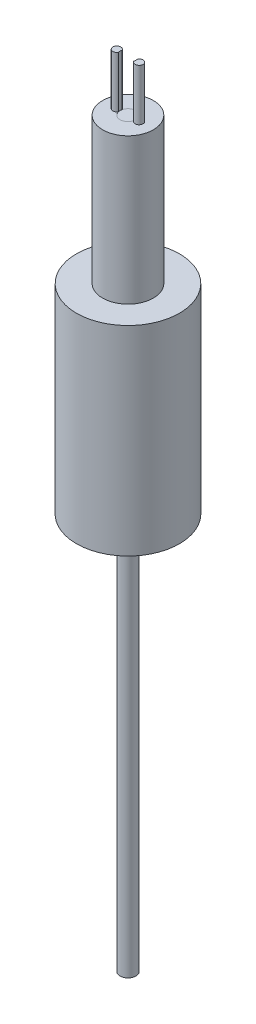
ISO-10303-21;
HEADER;
FILE_DESCRIPTION(('STEP AP214'),'2;1');
FILE_NAME('part.step','',(''),(''),'','','');
FILE_SCHEMA(('AUTOMOTIVE_DESIGN { 1 0 10303 214 1 1 1 1 }'));
ENDSEC;
DATA;
#1=APPLICATION_CONTEXT('core data for automotive mechanical design processes');
#2=APPLICATION_PROTOCOL_DEFINITION('international standard','automotive_design',2000,#1);
#3=PRODUCT_CONTEXT('',#1,'mechanical');
#4=PRODUCT('Part','Part','',(#3));
#5=PRODUCT_RELATED_PRODUCT_CATEGORY('part','',(#4));
#6=PRODUCT_DEFINITION_FORMATION('','',#4);
#7=PRODUCT_DEFINITION_CONTEXT('part definition',#1,'design');
#8=PRODUCT_DEFINITION('design','',#6,#7);
#9=PRODUCT_DEFINITION_SHAPE('','',#8);
#10=(LENGTH_UNIT() NAMED_UNIT(*) SI_UNIT(.MILLI.,.METRE.));
#11=(NAMED_UNIT(*) PLANE_ANGLE_UNIT() SI_UNIT($,.RADIAN.));
#12=(NAMED_UNIT(*) SI_UNIT($,.STERADIAN.) SOLID_ANGLE_UNIT());
#13=UNCERTAINTY_MEASURE_WITH_UNIT(LENGTH_MEASURE(1.E-05),#10,'distance_accuracy_value','');
#14=(GEOMETRIC_REPRESENTATION_CONTEXT(3) GLOBAL_UNCERTAINTY_ASSIGNED_CONTEXT((#13)) GLOBAL_UNIT_ASSIGNED_CONTEXT((#10,
#11,#12)) REPRESENTATION_CONTEXT('',''));
#15=CARTESIAN_POINT('',(0.,0.,0.));
#16=DIRECTION('',(0.,0.,1.));
#17=DIRECTION('',(1.,0.,0.));
#18=AXIS2_PLACEMENT_3D('',#15,#16,#17);
#19=CARTESIAN_POINT('',(0.,43.6,0.));
#20=DIRECTION('',(0.,-1.,0.));
#21=DIRECTION('',(0.,0.,-1.));
#22=AXIS2_PLACEMENT_3D('',#19,#20,#21);
#23=CYLINDRICAL_SURFACE('',#22,1.);
#24=CARTESIAN_POINT('',(0.,43.6,0.));
#25=DIRECTION('',(0.,1.,0.));
#26=DIRECTION('',(0.,0.,1.));
#27=AXIS2_PLACEMENT_3D('',#24,#25,#26);
#28=CIRCLE('',#27,1.);
#29=CARTESIAN_POINT('',(0.,43.6,1.));
#30=VERTEX_POINT('',#29);
#31=EDGE_CURVE('E11',#30,#30,#28,.T.);
#32=ORIENTED_EDGE('',*,*,#31,.F.);
#33=EDGE_LOOP('',(#32));
#34=FACE_BOUND('',#33,.T.);
#35=CARTESIAN_POINT('',(0.,-50.,0.));
#36=DIRECTION('',(0.,1.,0.));
#37=DIRECTION('',(0.,0.,1.));
#38=AXIS2_PLACEMENT_3D('',#35,#36,#37);
#39=CIRCLE('',#38,1.);
#40=CARTESIAN_POINT('',(0.,-50.,1.));
#41=VERTEX_POINT('',#40);
#42=EDGE_CURVE('E59',#41,#41,#39,.T.);
#43=ORIENTED_EDGE('',*,*,#42,.T.);
#44=EDGE_LOOP('',(#43));
#45=FACE_BOUND('',#44,.T.);
#46=ADVANCED_FACE('F53',(#34,#45),#23,.T.);
#47=CARTESIAN_POINT('',(0.,43.6,0.));
#48=DIRECTION('',(0.,1.,0.));
#49=DIRECTION('',(0.,0.,1.));
#50=AXIS2_PLACEMENT_3D('',#47,#48,#49);
#51=PLANE('',#50);
#52=ORIENTED_EDGE('',*,*,#31,.T.);
#53=EDGE_LOOP('',(#52));
#54=FACE_BOUND('',#53,.T.);
#55=ADVANCED_FACE('F68',(#54),#51,.T.);
#56=CARTESIAN_POINT('',(0.,-50.,0.));
#57=DIRECTION('',(0.,1.,0.));
#58=DIRECTION('',(0.,0.,1.));
#59=AXIS2_PLACEMENT_3D('',#56,#57,#58);
#60=PLANE('',#59);
#61=ORIENTED_EDGE('',*,*,#42,.F.);
#62=EDGE_LOOP('',(#61));
#63=FACE_BOUND('',#62,.T.);
#64=ADVANCED_FACE('F66',(#63),#60,.F.);
#65=CLOSED_SHELL('',(#46,#55,#64));
#66=MANIFOLD_SOLID_BREP('B2',#65);
#67=CARTESIAN_POINT('',(0.,50.1,0.));
#68=DIRECTION('',(0.,-1.,0.));
#69=DIRECTION('',(0.,0.,-1.));
#70=AXIS2_PLACEMENT_3D('',#67,#68,#69);
#71=CYLINDRICAL_SURFACE('',#70,1.);
#72=CARTESIAN_POINT('',(0.,0.,0.));
#73=DIRECTION('',(0.,1.,0.));
#74=DIRECTION('',(0.,0.,1.));
#75=AXIS2_PLACEMENT_3D('',#72,#73,#74);
#76=CIRCLE('',#75,1.);
#77=CARTESIAN_POINT('',(0.,0.,1.));
#78=VERTEX_POINT('',#77);
#79=EDGE_CURVE('E185',#78,#78,#76,.T.);
#80=ORIENTED_EDGE('',*,*,#79,.F.);
#81=EDGE_LOOP('',(#80));
#82=FACE_BOUND('',#81,.T.);
#83=DIRECTION('',(0.,-1.,0.));
#84=VECTOR('',#83,1.);
#85=CARTESIAN_POINT('',(-0.969692309701334,50.1,0.244329336155307));
#86=LINE('',#85,#84);
#87=CARTESIAN_POINT('',(-0.969692309701334,50.1,0.244329336155307));
#88=VERTEX_POINT('',#87);
#89=CARTESIAN_POINT('',(-0.969692309701334,43.6,0.244329336155307));
#90=VERTEX_POINT('',#89);
#91=EDGE_CURVE('E160',#88,#90,#86,.T.);
#92=ORIENTED_EDGE('',*,*,#91,.T.);
#93=CARTESIAN_POINT('',(0.,43.6,0.));
#94=DIRECTION('',(0.,1.,0.));
#95=DIRECTION('',(0.,0.,1.));
#96=AXIS2_PLACEMENT_3D('',#93,#94,#95);
#97=CIRCLE('',#96,1.);
#98=CARTESIAN_POINT('',(0.969692309701334,43.6,0.244329336155307));
#99=VERTEX_POINT('',#98);
#100=EDGE_CURVE('E178',#90,#99,#97,.T.);
#101=ORIENTED_EDGE('',*,*,#100,.T.);
#102=DIRECTION('',(0.,-1.,0.));
#103=VECTOR('',#102,1.);
#104=CARTESIAN_POINT('',(0.969692309701334,50.1,0.244329336155307));
#105=LINE('',#104,#103);
#106=CARTESIAN_POINT('',(0.969692309701334,50.1,0.244329336155307));
#107=VERTEX_POINT('',#106);
#108=EDGE_CURVE('E51',#107,#99,#105,.T.);
#109=ORIENTED_EDGE('',*,*,#108,.F.);
#110=CARTESIAN_POINT('',(0.,50.1,0.));
#111=DIRECTION('',(0.,1.,0.));
#112=DIRECTION('',(0.,0.,1.));
#113=AXIS2_PLACEMENT_3D('',#110,#111,#112);
#114=CIRCLE('',#113,1.);
#115=CARTESIAN_POINT('',(0.969692309701334,50.1,-0.244329336155307));
#116=VERTEX_POINT('',#115);
#117=EDGE_CURVE('E186',#107,#116,#114,.T.);
#118=ORIENTED_EDGE('',*,*,#117,.T.);
#119=DIRECTION('',(0.,-1.,0.));
#120=VECTOR('',#119,1.);
#121=CARTESIAN_POINT('',(0.969692309701334,50.1,-0.244329336155307));
#122=LINE('',#121,#120);
#123=CARTESIAN_POINT('',(0.969692309701334,43.6,-0.244329336155307));
#124=VERTEX_POINT('',#123);
#125=EDGE_CURVE('E120',#116,#124,#122,.T.);
#126=ORIENTED_EDGE('',*,*,#125,.T.);
#127=CARTESIAN_POINT('',(-0.969692309701334,43.6,-0.244329336155307));
#128=VERTEX_POINT('',#127);
#129=EDGE_CURVE('E156',#124,#128,#97,.T.);
#130=ORIENTED_EDGE('',*,*,#129,.T.);
#131=DIRECTION('',(0.,-1.,0.));
#132=VECTOR('',#131,1.);
#133=CARTESIAN_POINT('',(-0.969692309701334,50.1,-0.244329336155307));
#134=LINE('',#133,#132);
#135=CARTESIAN_POINT('',(-0.969692309701334,50.1,-0.244329336155307));
#136=VERTEX_POINT('',#135);
#137=EDGE_CURVE('E150',#136,#128,#134,.T.);
#138=ORIENTED_EDGE('',*,*,#137,.F.);
#139=CARTESIAN_POINT('',(0.,50.1,0.));
#140=DIRECTION('',(0.,1.,0.));
#141=DIRECTION('',(0.,0.,1.));
#142=AXIS2_PLACEMENT_3D('',#139,#140,#141);
#143=CIRCLE('',#142,1.);
#144=EDGE_CURVE('E154',#136,#88,#143,.T.);
#145=ORIENTED_EDGE('',*,*,#144,.T.);
#146=EDGE_LOOP('',(#92,#101,#109,#118,#126,#130,#138,#145));
#147=FACE_BOUND('',#146,.T.);
#148=ADVANCED_FACE('F113',(#82,#147),#71,.F.);
#149=CARTESIAN_POINT('',(1.40592983157893,50.1,0.));
#150=DIRECTION('',(0.,-1.,0.));
#151=DIRECTION('',(0.,0.,-1.));
#152=AXIS2_PLACEMENT_3D('',#149,#150,#151);
#153=CYLINDRICAL_SURFACE('',#152,0.5);
#154=ORIENTED_EDGE('',*,*,#108,.T.);
#155=CARTESIAN_POINT('',(1.40592983157893,43.6,0.));
#156=DIRECTION('',(0.,1.,0.));
#157=DIRECTION('',(0.,0.,1.));
#158=AXIS2_PLACEMENT_3D('',#155,#156,#157);
#159=CIRCLE('',#158,0.5);
#160=EDGE_CURVE('E129',#99,#124,#159,.T.);
#161=ORIENTED_EDGE('',*,*,#160,.T.);
#162=ORIENTED_EDGE('',*,*,#125,.F.);
#163=CARTESIAN_POINT('',(1.40592983157893,50.1,0.));
#164=DIRECTION('',(0.,1.,0.));
#165=DIRECTION('',(0.,0.,1.));
#166=AXIS2_PLACEMENT_3D('',#163,#164,#165);
#167=CIRCLE('',#166,0.5);
#168=EDGE_CURVE('E189',#107,#116,#167,.T.);
#169=ORIENTED_EDGE('',*,*,#168,.F.);
#170=EDGE_LOOP('',(#154,#161,#162,#169));
#171=FACE_BOUND('',#170,.T.);
#172=ADVANCED_FACE('F197',(#171),#153,.T.);
#173=CARTESIAN_POINT('',(0.,50.1,0.));
#174=DIRECTION('',(0.,1.,0.));
#175=DIRECTION('',(0.,0.,1.));
#176=AXIS2_PLACEMENT_3D('',#173,#174,#175);
#177=PLANE('',#176);
#178=ORIENTED_EDGE('',*,*,#117,.F.);
#179=ORIENTED_EDGE('',*,*,#168,.T.);
#180=EDGE_LOOP('',(#178,#179));
#181=FACE_BOUND('',#180,.T.);
#182=ADVANCED_FACE('F199',(#181),#177,.T.);
#183=CARTESIAN_POINT('',(0.,0.,0.));
#184=DIRECTION('',(0.,1.,0.));
#185=DIRECTION('',(0.,0.,1.));
#186=AXIS2_PLACEMENT_3D('',#183,#184,#185);
#187=PLANE('',#186);
#188=ORIENTED_EDGE('',*,*,#79,.T.);
#189=EDGE_LOOP('',(#188));
#190=FACE_BOUND('',#189,.T.);
#191=CARTESIAN_POINT('',(0.,0.,0.));
#192=DIRECTION('',(0.,1.,0.));
#193=DIRECTION('',(0.,0.,1.));
#194=AXIS2_PLACEMENT_3D('',#191,#192,#193);
#195=CIRCLE('',#194,6.5);
#196=CARTESIAN_POINT('',(0.,0.,6.5));
#197=VERTEX_POINT('',#196);
#198=EDGE_CURVE('E174',#197,#197,#195,.T.);
#199=ORIENTED_EDGE('',*,*,#198,.F.);
#200=EDGE_LOOP('',(#199));
#201=FACE_BOUND('',#200,.T.);
#202=ADVANCED_FACE('F201',(#190,#201),#187,.F.);
#203=CARTESIAN_POINT('',(0.,43.6,0.));
#204=DIRECTION('',(0.,-1.,0.));
#205=DIRECTION('',(0.,0.,-1.));
#206=AXIS2_PLACEMENT_3D('',#203,#204,#205);
#207=CYLINDRICAL_SURFACE('',#206,3.2);
#208=CARTESIAN_POINT('',(0.,25.2,0.));
#209=DIRECTION('',(0.,1.,0.));
#210=DIRECTION('',(0.,0.,1.));
#211=AXIS2_PLACEMENT_3D('',#208,#209,#210);
#212=CIRCLE('',#211,3.2);
#213=CARTESIAN_POINT('',(0.,25.2,3.2));
#214=VERTEX_POINT('',#213);
#215=EDGE_CURVE('E171',#214,#214,#212,.T.);
#216=ORIENTED_EDGE('',*,*,#215,.T.);
#217=EDGE_LOOP('',(#216));
#218=FACE_BOUND('',#217,.T.);
#219=CARTESIAN_POINT('',(0.,43.6,0.));
#220=DIRECTION('',(0.,1.,0.));
#221=DIRECTION('',(0.,0.,1.));
#222=AXIS2_PLACEMENT_3D('',#219,#220,#221);
#223=CIRCLE('',#222,3.2);
#224=CARTESIAN_POINT('',(0.,43.6,3.2));
#225=VERTEX_POINT('',#224);
#226=EDGE_CURVE('E182',#225,#225,#223,.T.);
#227=ORIENTED_EDGE('',*,*,#226,.F.);
#228=EDGE_LOOP('',(#227));
#229=FACE_BOUND('',#228,.T.);
#230=ADVANCED_FACE('F207',(#218,#229),#207,.T.);
#231=CARTESIAN_POINT('',(0.,43.6,0.));
#232=DIRECTION('',(0.,1.,0.));
#233=DIRECTION('',(0.,0.,1.));
#234=AXIS2_PLACEMENT_3D('',#231,#232,#233);
#235=PLANE('',#234);
#236=ORIENTED_EDGE('',*,*,#129,.F.);
#237=ORIENTED_EDGE('',*,*,#160,.F.);
#238=ORIENTED_EDGE('',*,*,#100,.F.);
#239=CARTESIAN_POINT('',(-1.40592983157893,43.6,0.));
#240=DIRECTION('',(0.,1.,0.));
#241=DIRECTION('',(0.,0.,1.));
#242=AXIS2_PLACEMENT_3D('',#239,#240,#241);
#243=CIRCLE('',#242,0.5);
#244=EDGE_CURVE('E180',#128,#90,#243,.T.);
#245=ORIENTED_EDGE('',*,*,#244,.F.);
#246=EDGE_LOOP('',(#236,#237,#238,#245));
#247=FACE_BOUND('',#246,.T.);
#248=ORIENTED_EDGE('',*,*,#226,.T.);
#249=EDGE_LOOP('',(#248));
#250=FACE_BOUND('',#249,.T.);
#251=ADVANCED_FACE('F194',(#247,#250),#235,.T.);
#252=CARTESIAN_POINT('',(-1.40592983157893,50.1,0.));
#253=DIRECTION('',(0.,-1.,0.));
#254=DIRECTION('',(0.,0.,-1.));
#255=AXIS2_PLACEMENT_3D('',#252,#253,#254);
#256=CYLINDRICAL_SURFACE('',#255,0.5);
#257=ORIENTED_EDGE('',*,*,#244,.T.);
#258=ORIENTED_EDGE('',*,*,#91,.F.);
#259=CARTESIAN_POINT('',(-1.40592983157893,50.1,0.));
#260=DIRECTION('',(0.,1.,0.));
#261=DIRECTION('',(0.,0.,1.));
#262=AXIS2_PLACEMENT_3D('',#259,#260,#261);
#263=CIRCLE('',#262,0.5);
#264=EDGE_CURVE('E163',#136,#88,#263,.T.);
#265=ORIENTED_EDGE('',*,*,#264,.F.);
#266=ORIENTED_EDGE('',*,*,#137,.T.);
#267=EDGE_LOOP('',(#257,#258,#265,#266));
#268=FACE_BOUND('',#267,.T.);
#269=ADVANCED_FACE('F164',(#268),#256,.T.);
#270=CARTESIAN_POINT('',(0.,50.1,0.));
#271=DIRECTION('',(0.,1.,0.));
#272=DIRECTION('',(0.,0.,1.));
#273=AXIS2_PLACEMENT_3D('',#270,#271,#272);
#274=PLANE('',#273);
#275=ORIENTED_EDGE('',*,*,#144,.F.);
#276=ORIENTED_EDGE('',*,*,#264,.T.);
#277=EDGE_LOOP('',(#275,#276));
#278=FACE_BOUND('',#277,.T.);
#279=ADVANCED_FACE('F167',(#278),#274,.T.);
#280=CARTESIAN_POINT('',(0.,25.2,0.));
#281=DIRECTION('',(0.,-1.,0.));
#282=DIRECTION('',(0.,0.,-1.));
#283=AXIS2_PLACEMENT_3D('',#280,#281,#282);
#284=CYLINDRICAL_SURFACE('',#283,6.5);
#285=CARTESIAN_POINT('',(0.,25.2,0.));
#286=DIRECTION('',(0.,1.,0.));
#287=DIRECTION('',(0.,0.,1.));
#288=AXIS2_PLACEMENT_3D('',#285,#286,#287);
#289=CIRCLE('',#288,6.5);
#290=CARTESIAN_POINT('',(0.,25.2,6.5));
#291=VERTEX_POINT('',#290);
#292=EDGE_CURVE('E168',#291,#291,#289,.T.);
#293=ORIENTED_EDGE('',*,*,#292,.F.);
#294=EDGE_LOOP('',(#293));
#295=FACE_BOUND('',#294,.T.);
#296=ORIENTED_EDGE('',*,*,#198,.T.);
#297=EDGE_LOOP('',(#296));
#298=FACE_BOUND('',#297,.T.);
#299=ADVANCED_FACE('F229',(#295,#298),#284,.T.);
#300=CARTESIAN_POINT('',(0.,25.2,0.));
#301=DIRECTION('',(0.,1.,0.));
#302=DIRECTION('',(0.,0.,1.));
#303=AXIS2_PLACEMENT_3D('',#300,#301,#302);
#304=PLANE('',#303);
#305=ORIENTED_EDGE('',*,*,#215,.F.);
#306=EDGE_LOOP('',(#305));
#307=FACE_BOUND('',#306,.T.);
#308=ORIENTED_EDGE('',*,*,#292,.T.);
#309=EDGE_LOOP('',(#308));
#310=FACE_BOUND('',#309,.T.);
#311=ADVANCED_FACE('F226',(#307,#310),#304,.T.);
#312=CLOSED_SHELL('',(#148,#172,#182,#202,#230,#251,#269,#279,#299,#311));
#313=MANIFOLD_SOLID_BREP('B6',#312);
#314=ADVANCED_BREP_SHAPE_REPRESENTATION('',(#18,#66,#313),#14);
#315=SHAPE_DEFINITION_REPRESENTATION(#9,#314);
ENDSEC;
END-ISO-10303-21;
